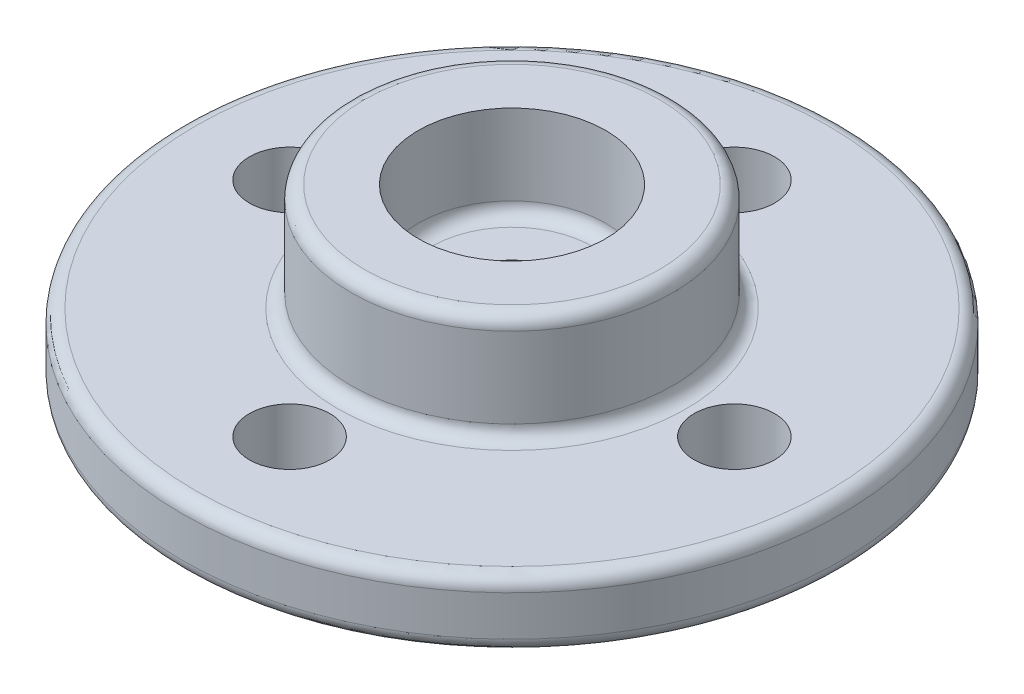
ISO-10303-21;
HEADER;
FILE_DESCRIPTION(('STEP AP214'),'2;1');
FILE_NAME('part.step','',(''),(''),'','','');
FILE_SCHEMA(('AUTOMOTIVE_DESIGN { 1 0 10303 214 1 1 1 1 }'));
ENDSEC;
DATA;
#1=APPLICATION_CONTEXT('core data for automotive mechanical design processes');
#2=APPLICATION_PROTOCOL_DEFINITION('international standard','automotive_design',2000,#1);
#3=PRODUCT_CONTEXT('',#1,'mechanical');
#4=PRODUCT('Part','Part','',(#3));
#5=PRODUCT_RELATED_PRODUCT_CATEGORY('part','',(#4));
#6=PRODUCT_DEFINITION_FORMATION('','',#4);
#7=PRODUCT_DEFINITION_CONTEXT('part definition',#1,'design');
#8=PRODUCT_DEFINITION('design','',#6,#7);
#9=PRODUCT_DEFINITION_SHAPE('','',#8);
#10=(LENGTH_UNIT() NAMED_UNIT(*) SI_UNIT(.MILLI.,.METRE.));
#11=(NAMED_UNIT(*) PLANE_ANGLE_UNIT() SI_UNIT($,.RADIAN.));
#12=(NAMED_UNIT(*) SI_UNIT($,.STERADIAN.) SOLID_ANGLE_UNIT());
#13=UNCERTAINTY_MEASURE_WITH_UNIT(LENGTH_MEASURE(1.E-05),#10,'distance_accuracy_value','');
#14=(GEOMETRIC_REPRESENTATION_CONTEXT(3) GLOBAL_UNCERTAINTY_ASSIGNED_CONTEXT((#13)) GLOBAL_UNIT_ASSIGNED_CONTEXT((#10,
#11,#12)) REPRESENTATION_CONTEXT('',''));
#15=CARTESIAN_POINT('',(0.,0.,0.));
#16=DIRECTION('',(0.,0.,1.));
#17=DIRECTION('',(1.,0.,0.));
#18=AXIS2_PLACEMENT_3D('',#15,#16,#17);
#19=CARTESIAN_POINT('',(0.,0.,-12.3));
#20=DIRECTION('',(0.,-1.,0.));
#21=DIRECTION('',(0.,0.,-1.));
#22=AXIS2_PLACEMENT_3D('',#19,#20,#21);
#23=PLANE('',#22);
#24=CARTESIAN_POINT('',(0.,0.,0.));
#25=DIRECTION('',(0.,-1.,0.));
#26=DIRECTION('',(0.,0.,-1.));
#27=AXIS2_PLACEMENT_3D('',#24,#25,#26);
#28=CIRCLE('',#27,11.8);
#29=CARTESIAN_POINT('',(0.,0.,-11.8));
#30=VERTEX_POINT('',#29);
#31=EDGE_CURVE('E65',#30,#30,#28,.T.);
#32=ORIENTED_EDGE('',*,*,#31,.T.);
#33=EDGE_LOOP('',(#32));
#34=FACE_BOUND('',#33,.T.);
#35=CARTESIAN_POINT('',(-8.3,0.,0.));
#36=DIRECTION('',(0.,-1.,0.));
#37=DIRECTION('',(-1.,0.,0.));
#38=AXIS2_PLACEMENT_3D('',#35,#36,#37);
#39=CIRCLE('',#38,1.5);
#40=CARTESIAN_POINT('',(-9.8,0.,-1.02649551361988E-13));
#41=VERTEX_POINT('',#40);
#42=EDGE_CURVE('E73',#41,#41,#39,.T.);
#43=ORIENTED_EDGE('',*,*,#42,.F.);
#44=EDGE_LOOP('',(#43));
#45=FACE_BOUND('',#44,.T.);
#46=CARTESIAN_POINT('',(0.,0.,8.3));
#47=DIRECTION('',(0.,-1.,0.));
#48=DIRECTION('',(0.,0.,1.));
#49=AXIS2_PLACEMENT_3D('',#46,#47,#48);
#50=CIRCLE('',#49,1.5);
#51=CARTESIAN_POINT('',(0.,0.,9.8));
#52=VERTEX_POINT('',#51);
#53=EDGE_CURVE('E72',#52,#52,#50,.T.);
#54=ORIENTED_EDGE('',*,*,#53,.F.);
#55=EDGE_LOOP('',(#54));
#56=FACE_BOUND('',#55,.T.);
#57=CARTESIAN_POINT('',(8.3,0.,0.));
#58=DIRECTION('',(0.,-1.,0.));
#59=DIRECTION('',(1.,0.,0.));
#60=AXIS2_PLACEMENT_3D('',#57,#58,#59);
#61=CIRCLE('',#60,1.5);
#62=CARTESIAN_POINT('',(9.8,0.,0.));
#63=VERTEX_POINT('',#62);
#64=EDGE_CURVE('E77',#63,#63,#61,.T.);
#65=ORIENTED_EDGE('',*,*,#64,.F.);
#66=EDGE_LOOP('',(#65));
#67=FACE_BOUND('',#66,.T.);
#68=CARTESIAN_POINT('',(0.,0.,-8.3));
#69=DIRECTION('',(0.,-1.,0.));
#70=DIRECTION('',(0.,0.,-1.));
#71=AXIS2_PLACEMENT_3D('',#68,#69,#70);
#72=CIRCLE('',#71,1.5);
#73=CARTESIAN_POINT('',(0.,0.,-9.8));
#74=VERTEX_POINT('',#73);
#75=EDGE_CURVE('E81',#74,#74,#72,.T.);
#76=ORIENTED_EDGE('',*,*,#75,.F.);
#77=EDGE_LOOP('',(#76));
#78=FACE_BOUND('',#77,.T.);
#79=CARTESIAN_POINT('',(0.,0.,0.));
#80=DIRECTION('',(0.,-1.,0.));
#81=DIRECTION('',(0.,0.,-1.));
#82=AXIS2_PLACEMENT_3D('',#79,#80,#81);
#83=CIRCLE('',#82,1.5);
#84=CARTESIAN_POINT('',(0.,0.,-1.5));
#85=VERTEX_POINT('',#84);
#86=EDGE_CURVE('E68',#85,#85,#83,.T.);
#87=ORIENTED_EDGE('',*,*,#86,.F.);
#88=EDGE_LOOP('',(#87));
#89=FACE_BOUND('',#88,.T.);
#90=ADVANCED_FACE('F30',(#34,#45,#56,#67,#78,#89),#23,.T.);
#91=CARTESIAN_POINT('',(0.,-5.73648248923873,0.));
#92=DIRECTION('',(0.,-1.,0.));
#93=DIRECTION('',(0.,0.,-1.));
#94=AXIS2_PLACEMENT_3D('',#91,#92,#93);
#95=CYLINDRICAL_SURFACE('',#94,1.5);
#96=ORIENTED_EDGE('',*,*,#86,.T.);
#97=EDGE_LOOP('',(#96));
#98=FACE_BOUND('',#97,.T.);
#99=CARTESIAN_POINT('',(0.,3.,0.));
#100=DIRECTION('',(0.,-1.,0.));
#101=DIRECTION('',(0.,0.,-1.));
#102=AXIS2_PLACEMENT_3D('',#99,#100,#101);
#103=CIRCLE('',#102,1.5);
#104=CARTESIAN_POINT('',(0.,3.,-1.5));
#105=VERTEX_POINT('',#104);
#106=EDGE_CURVE('E88',#105,#105,#103,.T.);
#107=ORIENTED_EDGE('',*,*,#106,.F.);
#108=EDGE_LOOP('',(#107));
#109=FACE_BOUND('',#108,.T.);
#110=ADVANCED_FACE('F106',(#98,#109),#95,.F.);
#111=CARTESIAN_POINT('',(0.,3.,-1.5));
#112=DIRECTION('',(0.,1.,0.));
#113=DIRECTION('',(0.,0.,1.));
#114=AXIS2_PLACEMENT_3D('',#111,#112,#113);
#115=PLANE('',#114);
#116=CARTESIAN_POINT('',(0.,3.,0.));
#117=DIRECTION('',(0.,1.,0.));
#118=DIRECTION('',(0.,0.,1.));
#119=AXIS2_PLACEMENT_3D('',#116,#117,#118);
#120=CIRCLE('',#119,3.);
#121=CARTESIAN_POINT('',(0.,3.,3.));
#122=VERTEX_POINT('',#121);
#123=EDGE_CURVE('E10',#122,#122,#120,.T.);
#124=ORIENTED_EDGE('',*,*,#123,.T.);
#125=EDGE_LOOP('',(#124));
#126=FACE_BOUND('',#125,.T.);
#127=ORIENTED_EDGE('',*,*,#106,.T.);
#128=EDGE_LOOP('',(#127));
#129=FACE_BOUND('',#128,.T.);
#130=ADVANCED_FACE('F119',(#126,#129),#115,.T.);
#131=CARTESIAN_POINT('',(0.,-5.73648248923873,0.));
#132=DIRECTION('',(0.,-1.,0.));
#133=DIRECTION('',(0.,0.,-1.));
#134=AXIS2_PLACEMENT_3D('',#131,#132,#133);
#135=CYLINDRICAL_SURFACE('',#134,3.5);
#136=CARTESIAN_POINT('',(0.,3.5,0.));
#137=DIRECTION('',(0.,1.,0.));
#138=DIRECTION('',(0.,0.,1.));
#139=AXIS2_PLACEMENT_3D('',#136,#137,#138);
#140=CIRCLE('',#139,3.5);
#141=CARTESIAN_POINT('',(0.,3.5,3.5));
#142=VERTEX_POINT('',#141);
#143=EDGE_CURVE('E37',#142,#142,#140,.F.);
#144=ORIENTED_EDGE('',*,*,#143,.T.);
#145=EDGE_LOOP('',(#144));
#146=FACE_BOUND('',#145,.T.);
#147=CARTESIAN_POINT('',(0.,6.5,0.));
#148=DIRECTION('',(0.,-1.,0.));
#149=DIRECTION('',(0.,0.,-1.));
#150=AXIS2_PLACEMENT_3D('',#147,#148,#149);
#151=CIRCLE('',#150,3.5);
#152=CARTESIAN_POINT('',(0.,6.5,-3.5));
#153=VERTEX_POINT('',#152);
#154=EDGE_CURVE('E85',#153,#153,#151,.T.);
#155=ORIENTED_EDGE('',*,*,#154,.F.);
#156=EDGE_LOOP('',(#155));
#157=FACE_BOUND('',#156,.T.);
#158=ADVANCED_FACE('F124',(#146,#157),#135,.F.);
#159=CARTESIAN_POINT('',(0.,6.5,-3.5));
#160=DIRECTION('',(0.,1.,0.));
#161=DIRECTION('',(0.,0.,1.));
#162=AXIS2_PLACEMENT_3D('',#159,#160,#161);
#163=PLANE('',#162);
#164=CARTESIAN_POINT('',(0.,6.5,0.));
#165=DIRECTION('',(0.,1.,0.));
#166=DIRECTION('',(0.,0.,1.));
#167=AXIS2_PLACEMENT_3D('',#164,#165,#166);
#168=CIRCLE('',#167,5.5);
#169=CARTESIAN_POINT('',(0.,6.5,5.5));
#170=VERTEX_POINT('',#169);
#171=EDGE_CURVE('E41',#170,#170,#168,.T.);
#172=ORIENTED_EDGE('',*,*,#171,.T.);
#173=EDGE_LOOP('',(#172));
#174=FACE_BOUND('',#173,.T.);
#175=ORIENTED_EDGE('',*,*,#154,.T.);
#176=EDGE_LOOP('',(#175));
#177=FACE_BOUND('',#176,.T.);
#178=ADVANCED_FACE('F129',(#174,#177),#163,.T.);
#179=CARTESIAN_POINT('',(0.,-5.73648248923873,0.));
#180=DIRECTION('',(0.,-1.,0.));
#181=DIRECTION('',(0.,0.,-1.));
#182=AXIS2_PLACEMENT_3D('',#179,#180,#181);
#183=CYLINDRICAL_SURFACE('',#182,6.);
#184=CARTESIAN_POINT('',(0.,6.,0.));
#185=DIRECTION('',(0.,1.,0.));
#186=DIRECTION('',(0.,0.,1.));
#187=AXIS2_PLACEMENT_3D('',#184,#185,#186);
#188=CIRCLE('',#187,6.);
#189=CARTESIAN_POINT('',(0.,6.,6.));
#190=VERTEX_POINT('',#189);
#191=EDGE_CURVE('E45',#190,#190,#188,.F.);
#192=ORIENTED_EDGE('',*,*,#191,.T.);
#193=EDGE_LOOP('',(#192));
#194=FACE_BOUND('',#193,.T.);
#195=CARTESIAN_POINT('',(0.,3.,0.));
#196=DIRECTION('',(0.,1.,0.));
#197=DIRECTION('',(0.,0.,1.));
#198=AXIS2_PLACEMENT_3D('',#195,#196,#197);
#199=CIRCLE('',#198,6.);
#200=CARTESIAN_POINT('',(0.,3.,6.));
#201=VERTEX_POINT('',#200);
#202=EDGE_CURVE('E50',#201,#201,#199,.T.);
#203=ORIENTED_EDGE('',*,*,#202,.T.);
#204=EDGE_LOOP('',(#203));
#205=FACE_BOUND('',#204,.T.);
#206=ADVANCED_FACE('F162',(#194,#205),#183,.T.);
#207=CARTESIAN_POINT('',(0.,2.5,-6.));
#208=DIRECTION('',(0.,1.,0.));
#209=DIRECTION('',(0.,0.,1.));
#210=AXIS2_PLACEMENT_3D('',#207,#208,#209);
#211=PLANE('',#210);
#212=CARTESIAN_POINT('',(0.,2.5,0.));
#213=DIRECTION('',(0.,1.,0.));
#214=DIRECTION('',(0.,0.,1.));
#215=AXIS2_PLACEMENT_3D('',#212,#213,#214);
#216=CIRCLE('',#215,11.8);
#217=CARTESIAN_POINT('',(0.,2.5,11.8));
#218=VERTEX_POINT('',#217);
#219=EDGE_CURVE('E53',#218,#218,#216,.T.);
#220=ORIENTED_EDGE('',*,*,#219,.T.);
#221=EDGE_LOOP('',(#220));
#222=FACE_BOUND('',#221,.T.);
#223=CARTESIAN_POINT('',(0.,2.5,0.));
#224=DIRECTION('',(0.,1.,0.));
#225=DIRECTION('',(0.,0.,1.));
#226=AXIS2_PLACEMENT_3D('',#223,#224,#225);
#227=CIRCLE('',#226,6.5);
#228=CARTESIAN_POINT('',(0.,2.5,6.5));
#229=VERTEX_POINT('',#228);
#230=EDGE_CURVE('E56',#229,#229,#227,.F.);
#231=ORIENTED_EDGE('',*,*,#230,.T.);
#232=EDGE_LOOP('',(#231));
#233=FACE_BOUND('',#232,.T.);
#234=CARTESIAN_POINT('',(-8.3,2.5,0.));
#235=DIRECTION('',(0.,1.,0.));
#236=DIRECTION('',(0.,0.,1.));
#237=AXIS2_PLACEMENT_3D('',#234,#235,#236);
#238=CIRCLE('',#237,1.5);
#239=CARTESIAN_POINT('',(-8.3,2.5,1.49999999999991));
#240=VERTEX_POINT('',#239);
#241=EDGE_CURVE('E69',#240,#240,#238,.T.);
#242=ORIENTED_EDGE('',*,*,#241,.F.);
#243=EDGE_LOOP('',(#242));
#244=FACE_BOUND('',#243,.T.);
#245=CARTESIAN_POINT('',(0.,2.5,8.3));
#246=DIRECTION('',(0.,1.,0.));
#247=DIRECTION('',(0.,0.,1.));
#248=AXIS2_PLACEMENT_3D('',#245,#246,#247);
#249=CIRCLE('',#248,1.5);
#250=CARTESIAN_POINT('',(0.,2.5,9.8));
#251=VERTEX_POINT('',#250);
#252=EDGE_CURVE('E74',#251,#251,#249,.T.);
#253=ORIENTED_EDGE('',*,*,#252,.F.);
#254=EDGE_LOOP('',(#253));
#255=FACE_BOUND('',#254,.T.);
#256=CARTESIAN_POINT('',(8.3,2.5,0.));
#257=DIRECTION('',(0.,1.,0.));
#258=DIRECTION('',(0.,0.,1.));
#259=AXIS2_PLACEMENT_3D('',#256,#257,#258);
#260=CIRCLE('',#259,1.5);
#261=CARTESIAN_POINT('',(8.3,2.5,1.50000000000003));
#262=VERTEX_POINT('',#261);
#263=EDGE_CURVE('E78',#262,#262,#260,.T.);
#264=ORIENTED_EDGE('',*,*,#263,.F.);
#265=EDGE_LOOP('',(#264));
#266=FACE_BOUND('',#265,.T.);
#267=CARTESIAN_POINT('',(0.,2.5,-8.3));
#268=DIRECTION('',(0.,1.,0.));
#269=DIRECTION('',(0.,0.,1.));
#270=AXIS2_PLACEMENT_3D('',#267,#268,#269);
#271=CIRCLE('',#270,1.5);
#272=CARTESIAN_POINT('',(0.,2.5,-6.8));
#273=VERTEX_POINT('',#272);
#274=EDGE_CURVE('E82',#273,#273,#271,.T.);
#275=ORIENTED_EDGE('',*,*,#274,.F.);
#276=EDGE_LOOP('',(#275));
#277=FACE_BOUND('',#276,.T.);
#278=ADVANCED_FACE('F158',(#222,#233,#244,#255,#266,#277),#211,.T.);
#279=CARTESIAN_POINT('',(0.,-5.73648248923873,0.));
#280=DIRECTION('',(0.,-1.,0.));
#281=DIRECTION('',(0.,0.,-1.));
#282=AXIS2_PLACEMENT_3D('',#279,#280,#281);
#283=CYLINDRICAL_SURFACE('',#282,12.3);
#284=CARTESIAN_POINT('',(0.,0.5,0.));
#285=DIRECTION('',(0.,-1.,0.));
#286=DIRECTION('',(0.,0.,-1.));
#287=AXIS2_PLACEMENT_3D('',#284,#285,#286);
#288=CIRCLE('',#287,12.3);
#289=CARTESIAN_POINT('',(0.,0.5,-12.3));
#290=VERTEX_POINT('',#289);
#291=EDGE_CURVE('E59',#290,#290,#288,.F.);
#292=ORIENTED_EDGE('',*,*,#291,.T.);
#293=EDGE_LOOP('',(#292));
#294=FACE_BOUND('',#293,.T.);
#295=CARTESIAN_POINT('',(0.,2.,0.));
#296=DIRECTION('',(0.,1.,0.));
#297=DIRECTION('',(0.,0.,1.));
#298=AXIS2_PLACEMENT_3D('',#295,#296,#297);
#299=CIRCLE('',#298,12.3);
#300=CARTESIAN_POINT('',(0.,2.,12.3));
#301=VERTEX_POINT('',#300);
#302=EDGE_CURVE('E62',#301,#301,#299,.F.);
#303=ORIENTED_EDGE('',*,*,#302,.T.);
#304=EDGE_LOOP('',(#303));
#305=FACE_BOUND('',#304,.T.);
#306=ADVANCED_FACE('F161',(#294,#305),#283,.T.);
#307=CARTESIAN_POINT('',(0.,10.,-8.3));
#308=DIRECTION('',(0.,-1.,0.));
#309=DIRECTION('',(0.,0.,-1.));
#310=AXIS2_PLACEMENT_3D('',#307,#308,#309);
#311=CYLINDRICAL_SURFACE('',#310,1.5);
#312=ORIENTED_EDGE('',*,*,#274,.T.);
#313=EDGE_LOOP('',(#312));
#314=FACE_BOUND('',#313,.T.);
#315=ORIENTED_EDGE('',*,*,#75,.T.);
#316=EDGE_LOOP('',(#315));
#317=FACE_BOUND('',#316,.T.);
#318=ADVANCED_FACE('F173',(#314,#317),#311,.F.);
#319=CARTESIAN_POINT('',(8.3,10.,0.));
#320=DIRECTION('',(0.,-1.,0.));
#321=DIRECTION('',(0.,0.,-1.));
#322=AXIS2_PLACEMENT_3D('',#319,#320,#321);
#323=CYLINDRICAL_SURFACE('',#322,1.5);
#324=ORIENTED_EDGE('',*,*,#263,.T.);
#325=EDGE_LOOP('',(#324));
#326=FACE_BOUND('',#325,.T.);
#327=ORIENTED_EDGE('',*,*,#64,.T.);
#328=EDGE_LOOP('',(#327));
#329=FACE_BOUND('',#328,.T.);
#330=ADVANCED_FACE('F176',(#326,#329),#323,.F.);
#331=CARTESIAN_POINT('',(0.,10.,8.3));
#332=DIRECTION('',(0.,-1.,0.));
#333=DIRECTION('',(0.,0.,-1.));
#334=AXIS2_PLACEMENT_3D('',#331,#332,#333);
#335=CYLINDRICAL_SURFACE('',#334,1.5);
#336=ORIENTED_EDGE('',*,*,#252,.T.);
#337=EDGE_LOOP('',(#336));
#338=FACE_BOUND('',#337,.T.);
#339=ORIENTED_EDGE('',*,*,#53,.T.);
#340=EDGE_LOOP('',(#339));
#341=FACE_BOUND('',#340,.T.);
#342=ADVANCED_FACE('F182',(#338,#341),#335,.F.);
#343=CARTESIAN_POINT('',(-8.3,10.,0.));
#344=DIRECTION('',(0.,-1.,0.));
#345=DIRECTION('',(0.,0.,-1.));
#346=AXIS2_PLACEMENT_3D('',#343,#344,#345);
#347=CYLINDRICAL_SURFACE('',#346,1.5);
#348=ORIENTED_EDGE('',*,*,#241,.T.);
#349=EDGE_LOOP('',(#348));
#350=FACE_BOUND('',#349,.T.);
#351=ORIENTED_EDGE('',*,*,#42,.T.);
#352=EDGE_LOOP('',(#351));
#353=FACE_BOUND('',#352,.T.);
#354=ADVANCED_FACE('F102',(#350,#353),#347,.F.);
#355=CARTESIAN_POINT('',(0.,0.5,0.));
#356=DIRECTION('',(0.,-1.,0.));
#357=DIRECTION('',(0.,0.,-1.));
#358=AXIS2_PLACEMENT_3D('',#355,#356,#357);
#359=TOROIDAL_SURFACE('',#358,11.8,0.5);
#360=ORIENTED_EDGE('',*,*,#291,.F.);
#361=EDGE_LOOP('',(#360));
#362=FACE_BOUND('',#361,.T.);
#363=ORIENTED_EDGE('',*,*,#31,.F.);
#364=EDGE_LOOP('',(#363));
#365=FACE_BOUND('',#364,.T.);
#366=ADVANCED_FACE('F133',(#362,#365),#359,.T.);
#367=CARTESIAN_POINT('',(0.,2.,0.));
#368=DIRECTION('',(0.,1.,0.));
#369=DIRECTION('',(0.,0.,1.));
#370=AXIS2_PLACEMENT_3D('',#367,#368,#369);
#371=TOROIDAL_SURFACE('',#370,11.8,0.5);
#372=ORIENTED_EDGE('',*,*,#219,.F.);
#373=EDGE_LOOP('',(#372));
#374=FACE_BOUND('',#373,.T.);
#375=ORIENTED_EDGE('',*,*,#302,.F.);
#376=EDGE_LOOP('',(#375));
#377=FACE_BOUND('',#376,.T.);
#378=ADVANCED_FACE('F136',(#374,#377),#371,.T.);
#379=CARTESIAN_POINT('',(0.,6.,0.));
#380=DIRECTION('',(0.,1.,0.));
#381=DIRECTION('',(0.,0.,1.));
#382=AXIS2_PLACEMENT_3D('',#379,#380,#381);
#383=TOROIDAL_SURFACE('',#382,5.5,0.5);
#384=ORIENTED_EDGE('',*,*,#171,.F.);
#385=EDGE_LOOP('',(#384));
#386=FACE_BOUND('',#385,.T.);
#387=ORIENTED_EDGE('',*,*,#191,.F.);
#388=EDGE_LOOP('',(#387));
#389=FACE_BOUND('',#388,.T.);
#390=ADVANCED_FACE('F140',(#386,#389),#383,.T.);
#391=CARTESIAN_POINT('',(0.,3.5,0.));
#392=DIRECTION('',(0.,1.,0.));
#393=DIRECTION('',(0.,0.,1.));
#394=AXIS2_PLACEMENT_3D('',#391,#392,#393);
#395=TOROIDAL_SURFACE('',#394,3.,0.5);
#396=ORIENTED_EDGE('',*,*,#123,.F.);
#397=EDGE_LOOP('',(#396));
#398=FACE_BOUND('',#397,.T.);
#399=ORIENTED_EDGE('',*,*,#143,.F.);
#400=EDGE_LOOP('',(#399));
#401=FACE_BOUND('',#400,.T.);
#402=ADVANCED_FACE('F143',(#398,#401),#395,.F.);
#403=CARTESIAN_POINT('',(0.,3.,0.));
#404=DIRECTION('',(0.,1.,0.));
#405=DIRECTION('',(0.,0.,1.));
#406=AXIS2_PLACEMENT_3D('',#403,#404,#405);
#407=TOROIDAL_SURFACE('',#406,6.5,0.5);
#408=ORIENTED_EDGE('',*,*,#202,.F.);
#409=EDGE_LOOP('',(#408));
#410=FACE_BOUND('',#409,.T.);
#411=ORIENTED_EDGE('',*,*,#230,.F.);
#412=EDGE_LOOP('',(#411));
#413=FACE_BOUND('',#412,.T.);
#414=ADVANCED_FACE('F32',(#410,#413),#407,.F.);
#415=CLOSED_SHELL('',(#90,#110,#130,#158,#178,#206,#278,#306,#318,#330,#342,#354,#366,#378,#390,
#402,#414));
#416=MANIFOLD_SOLID_BREP('B2',#415);
#417=ADVANCED_BREP_SHAPE_REPRESENTATION('',(#18,#416),#14);
#418=SHAPE_DEFINITION_REPRESENTATION(#9,#417);
ENDSEC;
END-ISO-10303-21;
